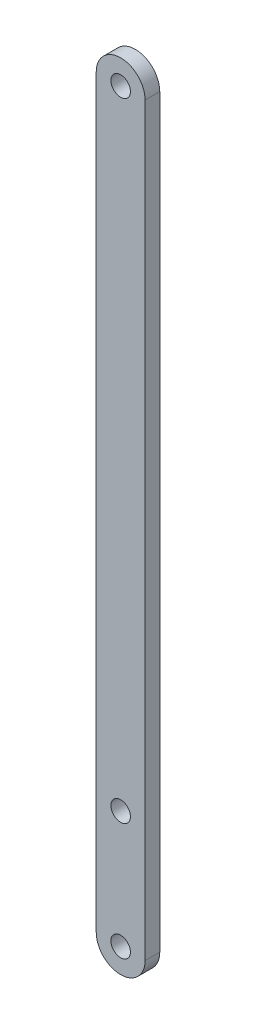
ISO-10303-21;
HEADER;
FILE_DESCRIPTION(('STEP AP214'),'2;1');
FILE_NAME('part.step','',(''),(''),'','','');
FILE_SCHEMA(('AUTOMOTIVE_DESIGN { 1 0 10303 214 1 1 1 1 }'));
ENDSEC;
DATA;
#1=APPLICATION_CONTEXT('core data for automotive mechanical design processes');
#2=APPLICATION_PROTOCOL_DEFINITION('international standard','automotive_design',2000,#1);
#3=PRODUCT_CONTEXT('',#1,'mechanical');
#4=PRODUCT('Part','Part','',(#3));
#5=PRODUCT_RELATED_PRODUCT_CATEGORY('part','',(#4));
#6=PRODUCT_DEFINITION_FORMATION('','',#4);
#7=PRODUCT_DEFINITION_CONTEXT('part definition',#1,'design');
#8=PRODUCT_DEFINITION('design','',#6,#7);
#9=PRODUCT_DEFINITION_SHAPE('','',#8);
#10=(LENGTH_UNIT() NAMED_UNIT(*) SI_UNIT(.MILLI.,.METRE.));
#11=(NAMED_UNIT(*) PLANE_ANGLE_UNIT() SI_UNIT($,.RADIAN.));
#12=(NAMED_UNIT(*) SI_UNIT($,.STERADIAN.) SOLID_ANGLE_UNIT());
#13=UNCERTAINTY_MEASURE_WITH_UNIT(LENGTH_MEASURE(1.E-05),#10,'distance_accuracy_value','');
#14=(GEOMETRIC_REPRESENTATION_CONTEXT(3) GLOBAL_UNCERTAINTY_ASSIGNED_CONTEXT((#13)) GLOBAL_UNIT_ASSIGNED_CONTEXT((#10,
#11,#12)) REPRESENTATION_CONTEXT('',''));
#15=CARTESIAN_POINT('',(0.,0.,0.));
#16=DIRECTION('',(0.,0.,1.));
#17=DIRECTION('',(1.,0.,0.));
#18=AXIS2_PLACEMENT_3D('',#15,#16,#17);
#19=CARTESIAN_POINT('',(5.,0.,3.));
#20=DIRECTION('',(1.,0.,0.));
#21=DIRECTION('',(0.,1.,0.));
#22=AXIS2_PLACEMENT_3D('',#19,#20,#21);
#23=PLANE('',#22);
#24=DIRECTION('',(0.,-1.,0.));
#25=VECTOR('',#24,1.);
#26=CARTESIAN_POINT('',(5.,0.,0.));
#27=LINE('',#26,#25);
#28=CARTESIAN_POINT('',(4.99999999999842,152.5,0.));
#29=VERTEX_POINT('',#28);
#30=CARTESIAN_POINT('',(5.,0.,0.));
#31=VERTEX_POINT('',#30);
#32=EDGE_CURVE('E126',#29,#31,#27,.T.);
#33=ORIENTED_EDGE('',*,*,#32,.F.);
#34=DIRECTION('',(0.,0.,-1.));
#35=VECTOR('',#34,1.);
#36=CARTESIAN_POINT('',(4.99999999999842,152.5,3.));
#37=LINE('',#36,#35);
#38=CARTESIAN_POINT('',(4.99999999999842,152.5,3.));
#39=VERTEX_POINT('',#38);
#40=EDGE_CURVE('E11',#39,#29,#37,.T.);
#41=ORIENTED_EDGE('',*,*,#40,.F.);
#42=DIRECTION('',(0.,-1.,0.));
#43=VECTOR('',#42,1.);
#44=CARTESIAN_POINT('',(5.,0.,3.));
#45=LINE('',#44,#43);
#46=CARTESIAN_POINT('',(5.,0.,3.));
#47=VERTEX_POINT('',#46);
#48=EDGE_CURVE('E95',#39,#47,#45,.T.);
#49=ORIENTED_EDGE('',*,*,#48,.T.);
#50=DIRECTION('',(0.,0.,-1.));
#51=VECTOR('',#50,1.);
#52=CARTESIAN_POINT('',(5.,0.,3.));
#53=LINE('',#52,#51);
#54=EDGE_CURVE('E84',#47,#31,#53,.T.);
#55=ORIENTED_EDGE('',*,*,#54,.T.);
#56=EDGE_LOOP('',(#33,#41,#49,#55));
#57=FACE_BOUND('',#56,.T.);
#58=ADVANCED_FACE('F45',(#57),#23,.T.);
#59=CARTESIAN_POINT('',(-3.18170261034948E-12,152.5,3.));
#60=DIRECTION('',(0.,0.,-1.));
#61=DIRECTION('',(-1.,0.,0.));
#62=AXIS2_PLACEMENT_3D('',#59,#60,#61);
#63=CYLINDRICAL_SURFACE('',#62,5.);
#64=CARTESIAN_POINT('',(-3.18170261034948E-12,152.5,0.));
#65=DIRECTION('',(0.,0.,1.));
#66=DIRECTION('',(1.,0.,0.));
#67=AXIS2_PLACEMENT_3D('',#64,#65,#66);
#68=CIRCLE('',#67,5.);
#69=CARTESIAN_POINT('',(-5.00000000000161,152.5,0.));
#70=VERTEX_POINT('',#69);
#71=EDGE_CURVE('E102',#29,#70,#68,.T.);
#72=ORIENTED_EDGE('',*,*,#71,.T.);
#73=DIRECTION('',(0.,0.,-1.));
#74=VECTOR('',#73,1.);
#75=CARTESIAN_POINT('',(-5.00000000000161,152.5,3.));
#76=LINE('',#75,#74);
#77=CARTESIAN_POINT('',(-5.00000000000161,152.5,3.));
#78=VERTEX_POINT('',#77);
#79=EDGE_CURVE('E54',#78,#70,#76,.T.);
#80=ORIENTED_EDGE('',*,*,#79,.F.);
#81=CARTESIAN_POINT('',(-3.18170261034948E-12,152.5,3.));
#82=DIRECTION('',(0.,0.,1.));
#83=DIRECTION('',(1.,0.,0.));
#84=AXIS2_PLACEMENT_3D('',#81,#82,#83);
#85=CIRCLE('',#84,5.);
#86=EDGE_CURVE('E89',#39,#78,#85,.T.);
#87=ORIENTED_EDGE('',*,*,#86,.F.);
#88=ORIENTED_EDGE('',*,*,#40,.T.);
#89=EDGE_LOOP('',(#72,#80,#87,#88));
#90=FACE_BOUND('',#89,.T.);
#91=ADVANCED_FACE('F100',(#90),#63,.T.);
#92=CARTESIAN_POINT('',(-5.,0.,3.));
#93=DIRECTION('',(-1.,0.,0.));
#94=DIRECTION('',(0.,-1.,0.));
#95=AXIS2_PLACEMENT_3D('',#92,#93,#94);
#96=PLANE('',#95);
#97=DIRECTION('',(0.,1.,0.));
#98=VECTOR('',#97,1.);
#99=CARTESIAN_POINT('',(-5.,0.,0.));
#100=LINE('',#99,#98);
#101=CARTESIAN_POINT('',(-5.,0.,0.));
#102=VERTEX_POINT('',#101);
#103=EDGE_CURVE('E132',#102,#70,#100,.T.);
#104=ORIENTED_EDGE('',*,*,#103,.F.);
#105=DIRECTION('',(0.,0.,-1.));
#106=VECTOR('',#105,1.);
#107=CARTESIAN_POINT('',(-5.,0.,3.));
#108=LINE('',#107,#106);
#109=CARTESIAN_POINT('',(-5.,0.,3.));
#110=VERTEX_POINT('',#109);
#111=EDGE_CURVE('E77',#110,#102,#108,.T.);
#112=ORIENTED_EDGE('',*,*,#111,.F.);
#113=DIRECTION('',(0.,1.,0.));
#114=VECTOR('',#113,1.);
#115=CARTESIAN_POINT('',(-5.,0.,3.));
#116=LINE('',#115,#114);
#117=EDGE_CURVE('E94',#110,#78,#116,.T.);
#118=ORIENTED_EDGE('',*,*,#117,.T.);
#119=ORIENTED_EDGE('',*,*,#79,.T.);
#120=EDGE_LOOP('',(#104,#112,#118,#119));
#121=FACE_BOUND('',#120,.T.);
#122=ADVANCED_FACE('F107',(#121),#96,.T.);
#123=CARTESIAN_POINT('',(0.,0.,3.));
#124=DIRECTION('',(0.,0.,-1.));
#125=DIRECTION('',(-1.,0.,0.));
#126=AXIS2_PLACEMENT_3D('',#123,#124,#125);
#127=CYLINDRICAL_SURFACE('',#126,2.);
#128=CARTESIAN_POINT('',(0.,0.,3.));
#129=DIRECTION('',(0.,0.,1.));
#130=DIRECTION('',(1.,0.,0.));
#131=AXIS2_PLACEMENT_3D('',#128,#129,#130);
#132=CIRCLE('',#131,2.);
#133=CARTESIAN_POINT('',(2.,0.,3.));
#134=VERTEX_POINT('',#133);
#135=EDGE_CURVE('E118',#134,#134,#132,.T.);
#136=ORIENTED_EDGE('',*,*,#135,.T.);
#137=EDGE_LOOP('',(#136));
#138=FACE_BOUND('',#137,.T.);
#139=CARTESIAN_POINT('',(0.,0.,0.));
#140=DIRECTION('',(0.,0.,1.));
#141=DIRECTION('',(1.,0.,0.));
#142=AXIS2_PLACEMENT_3D('',#139,#140,#141);
#143=CIRCLE('',#142,2.);
#144=CARTESIAN_POINT('',(2.,0.,0.));
#145=VERTEX_POINT('',#144);
#146=EDGE_CURVE('E142',#145,#145,#143,.T.);
#147=ORIENTED_EDGE('',*,*,#146,.F.);
#148=EDGE_LOOP('',(#147));
#149=FACE_BOUND('',#148,.T.);
#150=ADVANCED_FACE('F163',(#138,#149),#127,.F.);
#151=CARTESIAN_POINT('',(0.,24.,3.));
#152=DIRECTION('',(0.,0.,-1.));
#153=DIRECTION('',(-1.,0.,0.));
#154=AXIS2_PLACEMENT_3D('',#151,#152,#153);
#155=CYLINDRICAL_SURFACE('',#154,2.);
#156=CARTESIAN_POINT('',(0.,24.,3.));
#157=DIRECTION('',(0.,0.,1.));
#158=DIRECTION('',(1.,0.,0.));
#159=AXIS2_PLACEMENT_3D('',#156,#157,#158);
#160=CIRCLE('',#159,2.);
#161=CARTESIAN_POINT('',(2.,24.,3.));
#162=VERTEX_POINT('',#161);
#163=EDGE_CURVE('E111',#162,#162,#160,.T.);
#164=ORIENTED_EDGE('',*,*,#163,.T.);
#165=EDGE_LOOP('',(#164));
#166=FACE_BOUND('',#165,.T.);
#167=CARTESIAN_POINT('',(0.,24.,0.));
#168=DIRECTION('',(0.,0.,1.));
#169=DIRECTION('',(1.,0.,0.));
#170=AXIS2_PLACEMENT_3D('',#167,#168,#169);
#171=CIRCLE('',#170,2.);
#172=CARTESIAN_POINT('',(2.,24.,0.));
#173=VERTEX_POINT('',#172);
#174=EDGE_CURVE('E138',#173,#173,#171,.T.);
#175=ORIENTED_EDGE('',*,*,#174,.F.);
#176=EDGE_LOOP('',(#175));
#177=FACE_BOUND('',#176,.T.);
#178=ADVANCED_FACE('F170',(#166,#177),#155,.F.);
#179=CARTESIAN_POINT('',(0.,0.,3.));
#180=DIRECTION('',(0.,0.,-1.));
#181=DIRECTION('',(-1.,0.,0.));
#182=AXIS2_PLACEMENT_3D('',#179,#180,#181);
#183=CYLINDRICAL_SURFACE('',#182,5.);
#184=CARTESIAN_POINT('',(0.,0.,0.));
#185=DIRECTION('',(0.,0.,1.));
#186=DIRECTION('',(1.,0.,0.));
#187=AXIS2_PLACEMENT_3D('',#184,#185,#186);
#188=CIRCLE('',#187,5.);
#189=EDGE_CURVE('E135',#102,#31,#188,.T.);
#190=ORIENTED_EDGE('',*,*,#189,.T.);
#191=ORIENTED_EDGE('',*,*,#54,.F.);
#192=CARTESIAN_POINT('',(0.,0.,3.));
#193=DIRECTION('',(0.,0.,1.));
#194=DIRECTION('',(1.,0.,0.));
#195=AXIS2_PLACEMENT_3D('',#192,#193,#194);
#196=CIRCLE('',#195,5.);
#197=EDGE_CURVE('E62',#110,#47,#196,.T.);
#198=ORIENTED_EDGE('',*,*,#197,.F.);
#199=ORIENTED_EDGE('',*,*,#111,.T.);
#200=EDGE_LOOP('',(#190,#191,#198,#199));
#201=FACE_BOUND('',#200,.T.);
#202=ADVANCED_FACE('F166',(#201),#183,.T.);
#203=CARTESIAN_POINT('',(-3.18170261034948E-12,152.5,3.));
#204=DIRECTION('',(0.,0.,-1.));
#205=DIRECTION('',(-1.,0.,0.));
#206=AXIS2_PLACEMENT_3D('',#203,#204,#205);
#207=CYLINDRICAL_SURFACE('',#206,2.);
#208=CARTESIAN_POINT('',(-3.18170261034948E-12,152.5,3.));
#209=DIRECTION('',(0.,0.,1.));
#210=DIRECTION('',(1.,0.,0.));
#211=AXIS2_PLACEMENT_3D('',#208,#209,#210);
#212=CIRCLE('',#211,2.);
#213=CARTESIAN_POINT('',(1.99999999999682,152.5,3.));
#214=VERTEX_POINT('',#213);
#215=EDGE_CURVE('E122',#214,#214,#212,.T.);
#216=ORIENTED_EDGE('',*,*,#215,.T.);
#217=EDGE_LOOP('',(#216));
#218=FACE_BOUND('',#217,.T.);
#219=CARTESIAN_POINT('',(-3.18170261034948E-12,152.5,0.));
#220=DIRECTION('',(0.,0.,1.));
#221=DIRECTION('',(1.,0.,0.));
#222=AXIS2_PLACEMENT_3D('',#219,#220,#221);
#223=CIRCLE('',#222,2.);
#224=CARTESIAN_POINT('',(1.99999999999682,152.5,0.));
#225=VERTEX_POINT('',#224);
#226=EDGE_CURVE('E146',#225,#225,#223,.T.);
#227=ORIENTED_EDGE('',*,*,#226,.F.);
#228=EDGE_LOOP('',(#227));
#229=FACE_BOUND('',#228,.T.);
#230=ADVANCED_FACE('F169',(#218,#229),#207,.F.);
#231=CARTESIAN_POINT('',(0.,0.,3.));
#232=DIRECTION('',(0.,0.,1.));
#233=DIRECTION('',(1.,0.,0.));
#234=AXIS2_PLACEMENT_3D('',#231,#232,#233);
#235=PLANE('',#234);
#236=ORIENTED_EDGE('',*,*,#48,.F.);
#237=ORIENTED_EDGE('',*,*,#86,.T.);
#238=ORIENTED_EDGE('',*,*,#117,.F.);
#239=ORIENTED_EDGE('',*,*,#197,.T.);
#240=EDGE_LOOP('',(#236,#237,#238,#239));
#241=FACE_BOUND('',#240,.T.);
#242=ORIENTED_EDGE('',*,*,#163,.F.);
#243=EDGE_LOOP('',(#242));
#244=FACE_BOUND('',#243,.T.);
#245=ORIENTED_EDGE('',*,*,#135,.F.);
#246=EDGE_LOOP('',(#245));
#247=FACE_BOUND('',#246,.T.);
#248=ORIENTED_EDGE('',*,*,#215,.F.);
#249=EDGE_LOOP('',(#248));
#250=FACE_BOUND('',#249,.T.);
#251=ADVANCED_FACE('F91',(#241,#244,#247,#250),#235,.T.);
#252=CARTESIAN_POINT('',(0.,0.,0.));
#253=DIRECTION('',(0.,0.,1.));
#254=DIRECTION('',(1.,0.,0.));
#255=AXIS2_PLACEMENT_3D('',#252,#253,#254);
#256=PLANE('',#255);
#257=ORIENTED_EDGE('',*,*,#32,.T.);
#258=ORIENTED_EDGE('',*,*,#189,.F.);
#259=ORIENTED_EDGE('',*,*,#103,.T.);
#260=ORIENTED_EDGE('',*,*,#71,.F.);
#261=EDGE_LOOP('',(#257,#258,#259,#260));
#262=FACE_BOUND('',#261,.T.);
#263=ORIENTED_EDGE('',*,*,#174,.T.);
#264=EDGE_LOOP('',(#263));
#265=FACE_BOUND('',#264,.T.);
#266=ORIENTED_EDGE('',*,*,#146,.T.);
#267=EDGE_LOOP('',(#266));
#268=FACE_BOUND('',#267,.T.);
#269=ORIENTED_EDGE('',*,*,#226,.T.);
#270=EDGE_LOOP('',(#269));
#271=FACE_BOUND('',#270,.T.);
#272=ADVANCED_FACE('F180',(#262,#265,#268,#271),#256,.F.);
#273=CLOSED_SHELL('',(#58,#91,#122,#150,#178,#202,#230,#251,#272));
#274=MANIFOLD_SOLID_BREP('B2',#273);
#275=ADVANCED_BREP_SHAPE_REPRESENTATION('',(#18,#274),#14);
#276=SHAPE_DEFINITION_REPRESENTATION(#9,#275);
ENDSEC;
END-ISO-10303-21;
